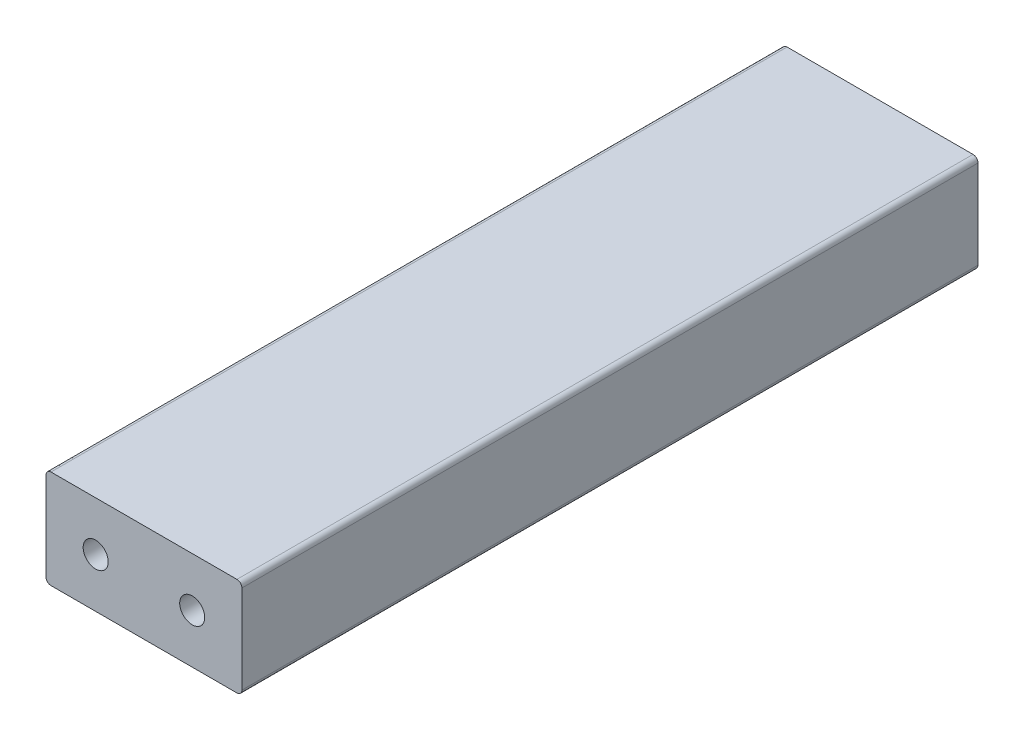
ISO-10303-21;
HEADER;
FILE_DESCRIPTION(('STEP AP214'),'2;1');
FILE_NAME('part.step','',(''),(''),'','','');
FILE_SCHEMA(('AUTOMOTIVE_DESIGN { 1 0 10303 214 1 1 1 1 }'));
ENDSEC;
DATA;
#1=APPLICATION_CONTEXT('core data for automotive mechanical design processes');
#2=APPLICATION_PROTOCOL_DEFINITION('international standard','automotive_design',2000,#1);
#3=PRODUCT_CONTEXT('',#1,'mechanical');
#4=PRODUCT('Part','Part','',(#3));
#5=PRODUCT_RELATED_PRODUCT_CATEGORY('part','',(#4));
#6=PRODUCT_DEFINITION_FORMATION('','',#4);
#7=PRODUCT_DEFINITION_CONTEXT('part definition',#1,'design');
#8=PRODUCT_DEFINITION('design','',#6,#7);
#9=PRODUCT_DEFINITION_SHAPE('','',#8);
#10=(LENGTH_UNIT() NAMED_UNIT(*) SI_UNIT(.MILLI.,.METRE.));
#11=(NAMED_UNIT(*) PLANE_ANGLE_UNIT() SI_UNIT($,.RADIAN.));
#12=(NAMED_UNIT(*) SI_UNIT($,.STERADIAN.) SOLID_ANGLE_UNIT());
#13=UNCERTAINTY_MEASURE_WITH_UNIT(LENGTH_MEASURE(1.E-05),#10,'distance_accuracy_value','');
#14=(GEOMETRIC_REPRESENTATION_CONTEXT(3) GLOBAL_UNCERTAINTY_ASSIGNED_CONTEXT((#13)) GLOBAL_UNIT_ASSIGNED_CONTEXT((#10,
#11,#12)) REPRESENTATION_CONTEXT('',''));
#15=CARTESIAN_POINT('',(0.,0.,0.));
#16=DIRECTION('',(0.,0.,1.));
#17=DIRECTION('',(1.,0.,0.));
#18=AXIS2_PLACEMENT_3D('',#15,#16,#17);
#19=CARTESIAN_POINT('',(19.9771,10.033,75.057));
#20=DIRECTION('',(-1.,0.,0.));
#21=DIRECTION('',(0.,0.,1.));
#22=AXIS2_PLACEMENT_3D('',#19,#20,#21);
#23=PLANE('',#22);
#24=DIRECTION('',(0.,1.,0.));
#25=VECTOR('',#24,1.);
#26=CARTESIAN_POINT('',(19.9771,10.033,75.057));
#27=LINE('',#26,#25);
#28=CARTESIAN_POINT('',(19.9771,-9.017,75.057));
#29=VERTEX_POINT('',#28);
#30=CARTESIAN_POINT('',(19.9771,9.017,75.057));
#31=VERTEX_POINT('',#30);
#32=EDGE_CURVE('E151',#29,#31,#27,.T.);
#33=ORIENTED_EDGE('',*,*,#32,.F.);
#34=DIRECTION('',(0.,0.,-1.));
#35=VECTOR('',#34,1.);
#36=CARTESIAN_POINT('',(19.9771,-9.017,75.057));
#37=LINE('',#36,#35);
#38=CARTESIAN_POINT('',(19.9771,-9.017,-75.057));
#39=VERTEX_POINT('',#38);
#40=EDGE_CURVE('E173',#29,#39,#37,.T.);
#41=ORIENTED_EDGE('',*,*,#40,.T.);
#42=DIRECTION('',(0.,1.,0.));
#43=VECTOR('',#42,1.);
#44=CARTESIAN_POINT('',(19.9771,10.033,-75.057));
#45=LINE('',#44,#43);
#46=CARTESIAN_POINT('',(19.9771,9.017,-75.057));
#47=VERTEX_POINT('',#46);
#48=EDGE_CURVE('E150',#39,#47,#45,.T.);
#49=ORIENTED_EDGE('',*,*,#48,.T.);
#50=DIRECTION('',(0.,0.,-1.));
#51=VECTOR('',#50,1.);
#52=CARTESIAN_POINT('',(19.9771,9.017,75.057));
#53=LINE('',#52,#51);
#54=EDGE_CURVE('E162',#47,#31,#53,.F.);
#55=ORIENTED_EDGE('',*,*,#54,.T.);
#56=EDGE_LOOP('',(#33,#41,#49,#55));
#57=FACE_BOUND('',#56,.T.);
#58=ADVANCED_FACE('F42',(#57),#23,.F.);
#59=CARTESIAN_POINT('',(-19.9771,10.033,75.057));
#60=DIRECTION('',(0.,-1.,0.));
#61=DIRECTION('',(0.,0.,-1.));
#62=AXIS2_PLACEMENT_3D('',#59,#60,#61);
#63=PLANE('',#62);
#64=DIRECTION('',(-1.,0.,0.));
#65=VECTOR('',#64,1.);
#66=CARTESIAN_POINT('',(-19.9771,10.033,75.057));
#67=LINE('',#66,#65);
#68=CARTESIAN_POINT('',(18.9611,10.033,75.057));
#69=VERTEX_POINT('',#68);
#70=CARTESIAN_POINT('',(-18.9611,10.033,75.057));
#71=VERTEX_POINT('',#70);
#72=EDGE_CURVE('E154',#69,#71,#67,.T.);
#73=ORIENTED_EDGE('',*,*,#72,.F.);
#74=DIRECTION('',(0.,0.,-1.));
#75=VECTOR('',#74,1.);
#76=CARTESIAN_POINT('',(18.9611,10.033,75.057));
#77=LINE('',#76,#75);
#78=CARTESIAN_POINT('',(18.9611,10.033,-75.057));
#79=VERTEX_POINT('',#78);
#80=EDGE_CURVE('E198',#69,#79,#77,.T.);
#81=ORIENTED_EDGE('',*,*,#80,.T.);
#82=DIRECTION('',(-1.,0.,0.));
#83=VECTOR('',#82,1.);
#84=CARTESIAN_POINT('',(-19.9771,10.033,-75.057));
#85=LINE('',#84,#83);
#86=CARTESIAN_POINT('',(-18.9611,10.033,-75.057));
#87=VERTEX_POINT('',#86);
#88=EDGE_CURVE('E165',#79,#87,#85,.T.);
#89=ORIENTED_EDGE('',*,*,#88,.T.);
#90=DIRECTION('',(0.,0.,-1.));
#91=VECTOR('',#90,1.);
#92=CARTESIAN_POINT('',(-18.9611,10.033,75.057));
#93=LINE('',#92,#91);
#94=EDGE_CURVE('E196',#87,#71,#93,.F.);
#95=ORIENTED_EDGE('',*,*,#94,.T.);
#96=EDGE_LOOP('',(#73,#81,#89,#95));
#97=FACE_BOUND('',#96,.T.);
#98=ADVANCED_FACE('F232',(#97),#63,.F.);
#99=CARTESIAN_POINT('',(-19.9771,10.033,75.057));
#100=DIRECTION('',(1.,0.,0.));
#101=DIRECTION('',(0.,1.,0.));
#102=AXIS2_PLACEMENT_3D('',#99,#100,#101);
#103=PLANE('',#102);
#104=DIRECTION('',(0.,-1.,0.));
#105=VECTOR('',#104,1.);
#106=CARTESIAN_POINT('',(-19.9771,10.033,-75.057));
#107=LINE('',#106,#105);
#108=CARTESIAN_POINT('',(-19.9771,9.017,-75.057));
#109=VERTEX_POINT('',#108);
#110=CARTESIAN_POINT('',(-19.9771,-9.017,-75.057));
#111=VERTEX_POINT('',#110);
#112=EDGE_CURVE('E168',#109,#111,#107,.T.);
#113=ORIENTED_EDGE('',*,*,#112,.T.);
#114=DIRECTION('',(0.,0.,-1.));
#115=VECTOR('',#114,1.);
#116=CARTESIAN_POINT('',(-19.9771,-9.017,75.057));
#117=LINE('',#116,#115);
#118=CARTESIAN_POINT('',(-19.9771,-9.017,75.057));
#119=VERTEX_POINT('',#118);
#120=EDGE_CURVE('E11',#111,#119,#117,.F.);
#121=ORIENTED_EDGE('',*,*,#120,.T.);
#122=DIRECTION('',(0.,-1.,0.));
#123=VECTOR('',#122,1.);
#124=CARTESIAN_POINT('',(-19.9771,10.033,75.057));
#125=LINE('',#124,#123);
#126=CARTESIAN_POINT('',(-19.9771,9.017,75.057));
#127=VERTEX_POINT('',#126);
#128=EDGE_CURVE('E157',#127,#119,#125,.T.);
#129=ORIENTED_EDGE('',*,*,#128,.F.);
#130=DIRECTION('',(0.,0.,-1.));
#131=VECTOR('',#130,1.);
#132=CARTESIAN_POINT('',(-19.9771,9.017,75.057));
#133=LINE('',#132,#131);
#134=EDGE_CURVE('E50',#127,#109,#133,.T.);
#135=ORIENTED_EDGE('',*,*,#134,.T.);
#136=EDGE_LOOP('',(#113,#121,#129,#135));
#137=FACE_BOUND('',#136,.T.);
#138=ADVANCED_FACE('F203',(#137),#103,.F.);
#139=CARTESIAN_POINT('',(-19.9771,-10.033,75.057));
#140=DIRECTION('',(0.,1.,0.));
#141=DIRECTION('',(0.,0.,1.));
#142=AXIS2_PLACEMENT_3D('',#139,#140,#141);
#143=PLANE('',#142);
#144=DIRECTION('',(1.,0.,0.));
#145=VECTOR('',#144,1.);
#146=CARTESIAN_POINT('',(-19.9771,-10.033,-75.057));
#147=LINE('',#146,#145);
#148=CARTESIAN_POINT('',(-18.9611,-10.033,-75.057));
#149=VERTEX_POINT('',#148);
#150=CARTESIAN_POINT('',(18.9611,-10.033,-75.057));
#151=VERTEX_POINT('',#150);
#152=EDGE_CURVE('E155',#149,#151,#147,.T.);
#153=ORIENTED_EDGE('',*,*,#152,.T.);
#154=DIRECTION('',(0.,0.,-1.));
#155=VECTOR('',#154,1.);
#156=CARTESIAN_POINT('',(18.9611,-10.033,75.057));
#157=LINE('',#156,#155);
#158=CARTESIAN_POINT('',(18.9611,-10.033,75.057));
#159=VERTEX_POINT('',#158);
#160=EDGE_CURVE('E187',#151,#159,#157,.F.);
#161=ORIENTED_EDGE('',*,*,#160,.T.);
#162=DIRECTION('',(1.,0.,0.));
#163=VECTOR('',#162,1.);
#164=CARTESIAN_POINT('',(-19.9771,-10.033,75.057));
#165=LINE('',#164,#163);
#166=CARTESIAN_POINT('',(-18.9611,-10.033,75.057));
#167=VERTEX_POINT('',#166);
#168=EDGE_CURVE('E159',#167,#159,#165,.T.);
#169=ORIENTED_EDGE('',*,*,#168,.F.);
#170=DIRECTION('',(0.,0.,-1.));
#171=VECTOR('',#170,1.);
#172=CARTESIAN_POINT('',(-18.9611,-10.033,75.057));
#173=LINE('',#172,#171);
#174=EDGE_CURVE('E184',#167,#149,#173,.T.);
#175=ORIENTED_EDGE('',*,*,#174,.T.);
#176=EDGE_LOOP('',(#153,#161,#169,#175));
#177=FACE_BOUND('',#176,.T.);
#178=ADVANCED_FACE('F216',(#177),#143,.F.);
#179=CARTESIAN_POINT('',(0.,0.,75.057));
#180=DIRECTION('',(0.,0.,1.));
#181=DIRECTION('',(1.,0.,0.));
#182=AXIS2_PLACEMENT_3D('',#179,#180,#181);
#183=PLANE('',#182);
#184=CARTESIAN_POINT('',(9.8425,0.,75.057));
#185=DIRECTION('',(0.,0.,1.));
#186=DIRECTION('',(1.,0.,0.));
#187=AXIS2_PLACEMENT_3D('',#184,#185,#186);
#188=CIRCLE('',#187,2.5527);
#189=CARTESIAN_POINT('',(12.3952,0.,75.057));
#190=VERTEX_POINT('',#189);
#191=EDGE_CURVE('E128',#190,#190,#188,.T.);
#192=ORIENTED_EDGE('',*,*,#191,.F.);
#193=EDGE_LOOP('',(#192));
#194=FACE_BOUND('',#193,.T.);
#195=CARTESIAN_POINT('',(-9.8425,0.,75.057));
#196=DIRECTION('',(0.,0.,1.));
#197=DIRECTION('',(1.,0.,0.));
#198=AXIS2_PLACEMENT_3D('',#195,#196,#197);
#199=CIRCLE('',#198,2.5527);
#200=CARTESIAN_POINT('',(-7.2898,0.,75.057));
#201=VERTEX_POINT('',#200);
#202=EDGE_CURVE('E127',#201,#201,#199,.T.);
#203=ORIENTED_EDGE('',*,*,#202,.F.);
#204=EDGE_LOOP('',(#203));
#205=FACE_BOUND('',#204,.T.);
#206=ORIENTED_EDGE('',*,*,#168,.T.);
#207=CARTESIAN_POINT('',(18.9611,-9.017,75.057));
#208=DIRECTION('',(0.,0.,1.));
#209=DIRECTION('',(1.,0.,0.));
#210=AXIS2_PLACEMENT_3D('',#207,#208,#209);
#211=CIRCLE('',#210,1.016);
#212=EDGE_CURVE('E194',#159,#29,#211,.T.);
#213=ORIENTED_EDGE('',*,*,#212,.T.);
#214=ORIENTED_EDGE('',*,*,#32,.T.);
#215=CARTESIAN_POINT('',(18.9611,9.017,75.057));
#216=DIRECTION('',(0.,0.,1.));
#217=DIRECTION('',(1.,0.,0.));
#218=AXIS2_PLACEMENT_3D('',#215,#216,#217);
#219=CIRCLE('',#218,1.016);
#220=EDGE_CURVE('E192',#31,#69,#219,.T.);
#221=ORIENTED_EDGE('',*,*,#220,.T.);
#222=ORIENTED_EDGE('',*,*,#72,.T.);
#223=CARTESIAN_POINT('',(-18.9611,9.017,75.057));
#224=DIRECTION('',(0.,0.,1.));
#225=DIRECTION('',(1.,0.,0.));
#226=AXIS2_PLACEMENT_3D('',#223,#224,#225);
#227=CIRCLE('',#226,1.016);
#228=EDGE_CURVE('E62',#71,#127,#227,.T.);
#229=ORIENTED_EDGE('',*,*,#228,.T.);
#230=ORIENTED_EDGE('',*,*,#128,.T.);
#231=CARTESIAN_POINT('',(-18.9611,-9.017,75.057));
#232=DIRECTION('',(0.,0.,1.));
#233=DIRECTION('',(1.,0.,0.));
#234=AXIS2_PLACEMENT_3D('',#231,#232,#233);
#235=CIRCLE('',#234,1.016);
#236=EDGE_CURVE('E190',#119,#167,#235,.T.);
#237=ORIENTED_EDGE('',*,*,#236,.T.);
#238=EDGE_LOOP('',(#206,#213,#214,#221,#222,#229,#230,#237));
#239=FACE_BOUND('',#238,.T.);
#240=ADVANCED_FACE('F219',(#194,#205,#239),#183,.T.);
#241=CARTESIAN_POINT('',(0.,0.,-75.057));
#242=DIRECTION('',(0.,0.,1.));
#243=DIRECTION('',(1.,0.,0.));
#244=AXIS2_PLACEMENT_3D('',#241,#242,#243);
#245=PLANE('',#244);
#246=CARTESIAN_POINT('',(9.8425,0.,-75.057));
#247=DIRECTION('',(0.,0.,-1.));
#248=DIRECTION('',(-1.,0.,0.));
#249=AXIS2_PLACEMENT_3D('',#246,#247,#248);
#250=CIRCLE('',#249,2.5527);
#251=CARTESIAN_POINT('',(7.2898,0.,-75.057));
#252=VERTEX_POINT('',#251);
#253=EDGE_CURVE('E138',#252,#252,#250,.T.);
#254=ORIENTED_EDGE('',*,*,#253,.F.);
#255=EDGE_LOOP('',(#254));
#256=FACE_BOUND('',#255,.T.);
#257=CARTESIAN_POINT('',(-9.8425,0.,-75.057));
#258=DIRECTION('',(0.,0.,-1.));
#259=DIRECTION('',(-1.,0.,0.));
#260=AXIS2_PLACEMENT_3D('',#257,#258,#259);
#261=CIRCLE('',#260,2.5527);
#262=CARTESIAN_POINT('',(-12.3952,0.,-75.057));
#263=VERTEX_POINT('',#262);
#264=EDGE_CURVE('E144',#263,#263,#261,.T.);
#265=ORIENTED_EDGE('',*,*,#264,.F.);
#266=EDGE_LOOP('',(#265));
#267=FACE_BOUND('',#266,.T.);
#268=ORIENTED_EDGE('',*,*,#48,.F.);
#269=CARTESIAN_POINT('',(18.9611,-9.017,-75.057));
#270=DIRECTION('',(0.,0.,1.));
#271=DIRECTION('',(1.,0.,0.));
#272=AXIS2_PLACEMENT_3D('',#269,#270,#271);
#273=CIRCLE('',#272,1.016);
#274=EDGE_CURVE('E182',#39,#151,#273,.F.);
#275=ORIENTED_EDGE('',*,*,#274,.T.);
#276=ORIENTED_EDGE('',*,*,#152,.F.);
#277=CARTESIAN_POINT('',(-18.9611,-9.017,-75.057));
#278=DIRECTION('',(0.,0.,1.));
#279=DIRECTION('',(1.,0.,0.));
#280=AXIS2_PLACEMENT_3D('',#277,#278,#279);
#281=CIRCLE('',#280,1.016);
#282=EDGE_CURVE('E178',#149,#111,#281,.F.);
#283=ORIENTED_EDGE('',*,*,#282,.T.);
#284=ORIENTED_EDGE('',*,*,#112,.F.);
#285=CARTESIAN_POINT('',(-18.9611,9.017,-75.057));
#286=DIRECTION('',(0.,0.,1.));
#287=DIRECTION('',(1.,0.,0.));
#288=AXIS2_PLACEMENT_3D('',#285,#286,#287);
#289=CIRCLE('',#288,1.016);
#290=EDGE_CURVE('E176',#109,#87,#289,.F.);
#291=ORIENTED_EDGE('',*,*,#290,.T.);
#292=ORIENTED_EDGE('',*,*,#88,.F.);
#293=CARTESIAN_POINT('',(18.9611,9.017,-75.057));
#294=DIRECTION('',(0.,0.,1.));
#295=DIRECTION('',(1.,0.,0.));
#296=AXIS2_PLACEMENT_3D('',#293,#294,#295);
#297=CIRCLE('',#296,1.016);
#298=EDGE_CURVE('E180',#79,#47,#297,.F.);
#299=ORIENTED_EDGE('',*,*,#298,.T.);
#300=EDGE_LOOP('',(#268,#275,#276,#283,#284,#291,#292,#299));
#301=FACE_BOUND('',#300,.T.);
#302=ADVANCED_FACE('F207',(#256,#267,#301),#245,.F.);
#303=CARTESIAN_POINT('',(18.9611,-9.017,75.057));
#304=DIRECTION('',(0.,0.,-1.));
#305=DIRECTION('',(-1.,0.,0.));
#306=AXIS2_PLACEMENT_3D('',#303,#304,#305);
#307=CYLINDRICAL_SURFACE('',#306,1.016);
#308=ORIENTED_EDGE('',*,*,#212,.F.);
#309=ORIENTED_EDGE('',*,*,#160,.F.);
#310=ORIENTED_EDGE('',*,*,#274,.F.);
#311=ORIENTED_EDGE('',*,*,#40,.F.);
#312=EDGE_LOOP('',(#308,#309,#310,#311));
#313=FACE_BOUND('',#312,.T.);
#314=ADVANCED_FACE('F223',(#313),#307,.T.);
#315=CARTESIAN_POINT('',(18.9611,9.017,75.057));
#316=DIRECTION('',(0.,0.,-1.));
#317=DIRECTION('',(-1.,0.,0.));
#318=AXIS2_PLACEMENT_3D('',#315,#316,#317);
#319=CYLINDRICAL_SURFACE('',#318,1.016);
#320=ORIENTED_EDGE('',*,*,#220,.F.);
#321=ORIENTED_EDGE('',*,*,#54,.F.);
#322=ORIENTED_EDGE('',*,*,#298,.F.);
#323=ORIENTED_EDGE('',*,*,#80,.F.);
#324=EDGE_LOOP('',(#320,#321,#322,#323));
#325=FACE_BOUND('',#324,.T.);
#326=ADVANCED_FACE('F229',(#325),#319,.T.);
#327=CARTESIAN_POINT('',(-18.9611,-9.017,75.057));
#328=DIRECTION('',(0.,0.,-1.));
#329=DIRECTION('',(-1.,0.,0.));
#330=AXIS2_PLACEMENT_3D('',#327,#328,#329);
#331=CYLINDRICAL_SURFACE('',#330,1.016);
#332=ORIENTED_EDGE('',*,*,#236,.F.);
#333=ORIENTED_EDGE('',*,*,#120,.F.);
#334=ORIENTED_EDGE('',*,*,#282,.F.);
#335=ORIENTED_EDGE('',*,*,#174,.F.);
#336=EDGE_LOOP('',(#332,#333,#334,#335));
#337=FACE_BOUND('',#336,.T.);
#338=ADVANCED_FACE('F213',(#337),#331,.T.);
#339=CARTESIAN_POINT('',(-18.9611,9.017,75.057));
#340=DIRECTION('',(0.,0.,-1.));
#341=DIRECTION('',(-1.,0.,0.));
#342=AXIS2_PLACEMENT_3D('',#339,#340,#341);
#343=CYLINDRICAL_SURFACE('',#342,1.016);
#344=ORIENTED_EDGE('',*,*,#228,.F.);
#345=ORIENTED_EDGE('',*,*,#94,.F.);
#346=ORIENTED_EDGE('',*,*,#290,.F.);
#347=ORIENTED_EDGE('',*,*,#134,.F.);
#348=EDGE_LOOP('',(#344,#345,#346,#347));
#349=FACE_BOUND('',#348,.T.);
#350=ADVANCED_FACE('F44',(#349),#343,.T.);
#351=CARTESIAN_POINT('',(-9.8425,0.,-58.547));
#352=DIRECTION('',(0.,0.,-1.));
#353=DIRECTION('',(-1.,0.,0.));
#354=AXIS2_PLACEMENT_3D('',#351,#352,#353);
#355=CONICAL_SURFACE('',#354,2.5527,1.02974425867665);
#356=CARTESIAN_POINT('',(-9.84250000000001,0.,-57.0131830978083));
#357=VERTEX_POINT('',#356);
#358=VERTEX_LOOP('',#357);
#359=FACE_BOUND('',#358,.T.);
#360=CARTESIAN_POINT('',(-9.8425,0.,-58.547));
#361=DIRECTION('',(0.,0.,-1.));
#362=DIRECTION('',(-1.,0.,0.));
#363=AXIS2_PLACEMENT_3D('',#360,#361,#362);
#364=CIRCLE('',#363,2.5527);
#365=CARTESIAN_POINT('',(-12.3952,0.,-58.547));
#366=VERTEX_POINT('',#365);
#367=EDGE_CURVE('E147',#366,#366,#364,.T.);
#368=ORIENTED_EDGE('',*,*,#367,.T.);
#369=EDGE_LOOP('',(#368));
#370=FACE_BOUND('',#369,.T.);
#371=ADVANCED_FACE('F235',(#359,#370),#355,.F.);
#372=CARTESIAN_POINT('',(-9.8425,0.,-75.057));
#373=DIRECTION('',(0.,0.,-1.));
#374=DIRECTION('',(-1.,0.,0.));
#375=AXIS2_PLACEMENT_3D('',#372,#373,#374);
#376=CYLINDRICAL_SURFACE('',#375,2.5527);
#377=ORIENTED_EDGE('',*,*,#367,.F.);
#378=EDGE_LOOP('',(#377));
#379=FACE_BOUND('',#378,.T.);
#380=ORIENTED_EDGE('',*,*,#264,.T.);
#381=EDGE_LOOP('',(#380));
#382=FACE_BOUND('',#381,.T.);
#383=ADVANCED_FACE('F240',(#379,#382),#376,.F.);
#384=CARTESIAN_POINT('',(9.8425,0.,-58.547));
#385=DIRECTION('',(0.,0.,-1.));
#386=DIRECTION('',(-1.,0.,0.));
#387=AXIS2_PLACEMENT_3D('',#384,#385,#386);
#388=CONICAL_SURFACE('',#387,2.5527,1.02974425867665);
#389=CARTESIAN_POINT('',(9.8425,0.,-57.0131830978083));
#390=VERTEX_POINT('',#389);
#391=VERTEX_LOOP('',#390);
#392=FACE_BOUND('',#391,.T.);
#393=CARTESIAN_POINT('',(9.8425,0.,-58.547));
#394=DIRECTION('',(0.,0.,-1.));
#395=DIRECTION('',(-1.,0.,0.));
#396=AXIS2_PLACEMENT_3D('',#393,#394,#395);
#397=CIRCLE('',#396,2.5527);
#398=CARTESIAN_POINT('',(7.2898,0.,-58.547));
#399=VERTEX_POINT('',#398);
#400=EDGE_CURVE('E141',#399,#399,#397,.T.);
#401=ORIENTED_EDGE('',*,*,#400,.T.);
#402=EDGE_LOOP('',(#401));
#403=FACE_BOUND('',#402,.T.);
#404=ADVANCED_FACE('F293',(#392,#403),#388,.F.);
#405=CARTESIAN_POINT('',(9.8425,0.,-75.057));
#406=DIRECTION('',(0.,0.,-1.));
#407=DIRECTION('',(-1.,0.,0.));
#408=AXIS2_PLACEMENT_3D('',#405,#406,#407);
#409=CYLINDRICAL_SURFACE('',#408,2.5527);
#410=ORIENTED_EDGE('',*,*,#400,.F.);
#411=EDGE_LOOP('',(#410));
#412=FACE_BOUND('',#411,.T.);
#413=ORIENTED_EDGE('',*,*,#253,.T.);
#414=EDGE_LOOP('',(#413));
#415=FACE_BOUND('',#414,.T.);
#416=ADVANCED_FACE('F307',(#412,#415),#409,.F.);
#417=CARTESIAN_POINT('',(-9.8425,0.,58.547));
#418=DIRECTION('',(0.,0.,1.));
#419=DIRECTION('',(1.,0.,0.));
#420=AXIS2_PLACEMENT_3D('',#417,#418,#419);
#421=CONICAL_SURFACE('',#420,2.5527,1.02974425867665);
#422=CARTESIAN_POINT('',(-9.84250000000001,0.,57.0131830978083));
#423=VERTEX_POINT('',#422);
#424=VERTEX_LOOP('',#423);
#425=FACE_BOUND('',#424,.T.);
#426=CARTESIAN_POINT('',(-9.8425,0.,58.547));
#427=DIRECTION('',(0.,0.,1.));
#428=DIRECTION('',(1.,0.,0.));
#429=AXIS2_PLACEMENT_3D('',#426,#427,#428);
#430=CIRCLE('',#429,2.5527);
#431=CARTESIAN_POINT('',(-7.2898,0.,58.547));
#432=VERTEX_POINT('',#431);
#433=EDGE_CURVE('E131',#432,#432,#430,.T.);
#434=ORIENTED_EDGE('',*,*,#433,.T.);
#435=EDGE_LOOP('',(#434));
#436=FACE_BOUND('',#435,.T.);
#437=ADVANCED_FACE('F318',(#425,#436),#421,.F.);
#438=CARTESIAN_POINT('',(-9.8425,0.,75.057));
#439=DIRECTION('',(0.,0.,1.));
#440=DIRECTION('',(1.,0.,0.));
#441=AXIS2_PLACEMENT_3D('',#438,#439,#440);
#442=CYLINDRICAL_SURFACE('',#441,2.5527);
#443=ORIENTED_EDGE('',*,*,#433,.F.);
#444=EDGE_LOOP('',(#443));
#445=FACE_BOUND('',#444,.T.);
#446=ORIENTED_EDGE('',*,*,#202,.T.);
#447=EDGE_LOOP('',(#446));
#448=FACE_BOUND('',#447,.T.);
#449=ADVANCED_FACE('F121',(#445,#448),#442,.F.);
#450=CARTESIAN_POINT('',(9.8425,0.,58.547));
#451=DIRECTION('',(0.,0.,1.));
#452=DIRECTION('',(1.,0.,0.));
#453=AXIS2_PLACEMENT_3D('',#450,#451,#452);
#454=CONICAL_SURFACE('',#453,2.5527,1.02974425867665);
#455=CARTESIAN_POINT('',(9.8425,0.,57.0131830978083));
#456=VERTEX_POINT('',#455);
#457=VERTEX_LOOP('',#456);
#458=FACE_BOUND('',#457,.T.);
#459=CARTESIAN_POINT('',(9.8425,0.,58.547));
#460=DIRECTION('',(0.,0.,1.));
#461=DIRECTION('',(1.,0.,0.));
#462=AXIS2_PLACEMENT_3D('',#459,#460,#461);
#463=CIRCLE('',#462,2.5527);
#464=CARTESIAN_POINT('',(12.3952,0.,58.547));
#465=VERTEX_POINT('',#464);
#466=EDGE_CURVE('E125',#465,#465,#463,.T.);
#467=ORIENTED_EDGE('',*,*,#466,.T.);
#468=EDGE_LOOP('',(#467));
#469=FACE_BOUND('',#468,.T.);
#470=ADVANCED_FACE('F117',(#458,#469),#454,.F.);
#471=CARTESIAN_POINT('',(9.8425,0.,75.057));
#472=DIRECTION('',(0.,0.,1.));
#473=DIRECTION('',(1.,0.,0.));
#474=AXIS2_PLACEMENT_3D('',#471,#472,#473);
#475=CYLINDRICAL_SURFACE('',#474,2.5527);
#476=ORIENTED_EDGE('',*,*,#466,.F.);
#477=EDGE_LOOP('',(#476));
#478=FACE_BOUND('',#477,.T.);
#479=ORIENTED_EDGE('',*,*,#191,.T.);
#480=EDGE_LOOP('',(#479));
#481=FACE_BOUND('',#480,.T.);
#482=ADVANCED_FACE('F120',(#478,#481),#475,.F.);
#483=CLOSED_SHELL('',(#58,#98,#138,#178,#240,#302,#314,#326,#338,#350,#371,#383,#404,#416,#437,
#449,#470,#482));
#484=MANIFOLD_SOLID_BREP('B2',#483);
#485=ADVANCED_BREP_SHAPE_REPRESENTATION('',(#18,#484),#14);
#486=SHAPE_DEFINITION_REPRESENTATION(#9,#485);
ENDSEC;
END-ISO-10303-21;
